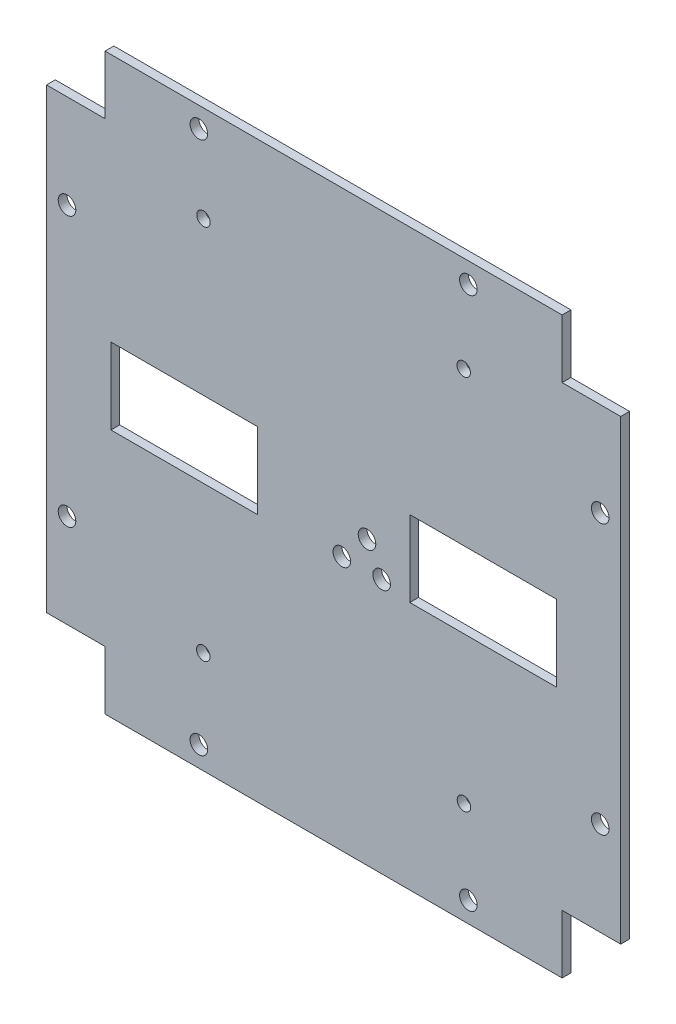
ISO-10303-21;
HEADER;
FILE_DESCRIPTION(('STEP AP214'),'2;1');
FILE_NAME('part.step','',(''),(''),'','','');
FILE_SCHEMA(('AUTOMOTIVE_DESIGN { 1 0 10303 214 1 1 1 1 }'));
ENDSEC;
DATA;
#1=APPLICATION_CONTEXT('core data for automotive mechanical design processes');
#2=APPLICATION_PROTOCOL_DEFINITION('international standard','automotive_design',2000,#1);
#3=PRODUCT_CONTEXT('',#1,'mechanical');
#4=PRODUCT('Part','Part','',(#3));
#5=PRODUCT_RELATED_PRODUCT_CATEGORY('part','',(#4));
#6=PRODUCT_DEFINITION_FORMATION('','',#4);
#7=PRODUCT_DEFINITION_CONTEXT('part definition',#1,'design');
#8=PRODUCT_DEFINITION('design','',#6,#7);
#9=PRODUCT_DEFINITION_SHAPE('','',#8);
#10=(LENGTH_UNIT() NAMED_UNIT(*) SI_UNIT(.MILLI.,.METRE.));
#11=(NAMED_UNIT(*) PLANE_ANGLE_UNIT() SI_UNIT($,.RADIAN.));
#12=(NAMED_UNIT(*) SI_UNIT($,.STERADIAN.) SOLID_ANGLE_UNIT());
#13=UNCERTAINTY_MEASURE_WITH_UNIT(LENGTH_MEASURE(1.E-05),#10,'distance_accuracy_value','');
#14=(GEOMETRIC_REPRESENTATION_CONTEXT(3) GLOBAL_UNCERTAINTY_ASSIGNED_CONTEXT((#13)) GLOBAL_UNIT_ASSIGNED_CONTEXT((#10,
#11,#12)) REPRESENTATION_CONTEXT('',''));
#15=CARTESIAN_POINT('',(0.,0.,0.));
#16=DIRECTION('',(0.,0.,1.));
#17=DIRECTION('',(1.,0.,0.));
#18=AXIS2_PLACEMENT_3D('',#15,#16,#17);
#19=CARTESIAN_POINT('',(-49.,-49.,1.5));
#20=DIRECTION('',(1.,0.,0.));
#21=DIRECTION('',(0.,0.,-1.));
#22=AXIS2_PLACEMENT_3D('',#19,#20,#21);
#23=PLANE('',#22);
#24=DIRECTION('',(0.,-1.,0.));
#25=VECTOR('',#24,1.);
#26=CARTESIAN_POINT('',(-49.,-49.,0.));
#27=LINE('',#26,#25);
#28=CARTESIAN_POINT('',(-49.,39.,0.));
#29=VERTEX_POINT('',#28);
#30=CARTESIAN_POINT('',(-49.,-39.,0.));
#31=VERTEX_POINT('',#30);
#32=EDGE_CURVE('E319',#29,#31,#27,.T.);
#33=ORIENTED_EDGE('',*,*,#32,.T.);
#34=DIRECTION('',(0.,0.,1.));
#35=VECTOR('',#34,1.);
#36=CARTESIAN_POINT('',(-49.,-39.,-8.5));
#37=LINE('',#36,#35);
#38=CARTESIAN_POINT('',(-49.,-39.,1.5));
#39=VERTEX_POINT('',#38);
#40=EDGE_CURVE('E277',#31,#39,#37,.T.);
#41=ORIENTED_EDGE('',*,*,#40,.T.);
#42=DIRECTION('',(0.,-1.,0.));
#43=VECTOR('',#42,1.);
#44=CARTESIAN_POINT('',(-49.,-49.,1.5));
#45=LINE('',#44,#43);
#46=CARTESIAN_POINT('',(-49.,39.,1.5));
#47=VERTEX_POINT('',#46);
#48=EDGE_CURVE('E323',#47,#39,#45,.T.);
#49=ORIENTED_EDGE('',*,*,#48,.F.);
#50=DIRECTION('',(0.,0.,1.));
#51=VECTOR('',#50,1.);
#52=CARTESIAN_POINT('',(-49.,39.,-8.5));
#53=LINE('',#52,#51);
#54=EDGE_CURVE('E315',#29,#47,#53,.T.);
#55=ORIENTED_EDGE('',*,*,#54,.F.);
#56=EDGE_LOOP('',(#33,#41,#49,#55));
#57=FACE_BOUND('',#56,.T.);
#58=ADVANCED_FACE('F37',(#57),#23,.F.);
#59=CARTESIAN_POINT('',(49.,-49.,1.5));
#60=DIRECTION('',(0.,1.,0.));
#61=DIRECTION('',(-1.,0.,0.));
#62=AXIS2_PLACEMENT_3D('',#59,#60,#61);
#63=PLANE('',#62);
#64=DIRECTION('',(1.,0.,0.));
#65=VECTOR('',#64,1.);
#66=CARTESIAN_POINT('',(49.,-49.,1.5));
#67=LINE('',#66,#65);
#68=CARTESIAN_POINT('',(-39.,-49.,1.5));
#69=VERTEX_POINT('',#68);
#70=CARTESIAN_POINT('',(39.,-49.,1.5));
#71=VERTEX_POINT('',#70);
#72=EDGE_CURVE('E326',#69,#71,#67,.T.);
#73=ORIENTED_EDGE('',*,*,#72,.F.);
#74=DIRECTION('',(0.,0.,1.));
#75=VECTOR('',#74,1.);
#76=CARTESIAN_POINT('',(-39.,-49.,-8.5));
#77=LINE('',#76,#75);
#78=CARTESIAN_POINT('',(-39.,-49.,0.));
#79=VERTEX_POINT('',#78);
#80=EDGE_CURVE('E276',#79,#69,#77,.T.);
#81=ORIENTED_EDGE('',*,*,#80,.F.);
#82=DIRECTION('',(1.,0.,0.));
#83=VECTOR('',#82,1.);
#84=CARTESIAN_POINT('',(49.,-49.,0.));
#85=LINE('',#84,#83);
#86=CARTESIAN_POINT('',(39.,-49.,0.));
#87=VERTEX_POINT('',#86);
#88=EDGE_CURVE('E336',#79,#87,#85,.T.);
#89=ORIENTED_EDGE('',*,*,#88,.T.);
#90=DIRECTION('',(0.,0.,1.));
#91=VECTOR('',#90,1.);
#92=CARTESIAN_POINT('',(39.,-49.,-8.5));
#93=LINE('',#92,#91);
#94=EDGE_CURVE('E290',#87,#71,#93,.T.);
#95=ORIENTED_EDGE('',*,*,#94,.T.);
#96=EDGE_LOOP('',(#73,#81,#89,#95));
#97=FACE_BOUND('',#96,.T.);
#98=ADVANCED_FACE('F425',(#97),#63,.F.);
#99=CARTESIAN_POINT('',(49.,-49.,1.5));
#100=DIRECTION('',(-1.,0.,0.));
#101=DIRECTION('',(0.,0.,1.));
#102=AXIS2_PLACEMENT_3D('',#99,#100,#101);
#103=PLANE('',#102);
#104=DIRECTION('',(0.,1.,0.));
#105=VECTOR('',#104,1.);
#106=CARTESIAN_POINT('',(49.,-49.,1.5));
#107=LINE('',#106,#105);
#108=CARTESIAN_POINT('',(49.,-39.,1.5));
#109=VERTEX_POINT('',#108);
#110=CARTESIAN_POINT('',(49.,39.,1.5));
#111=VERTEX_POINT('',#110);
#112=EDGE_CURVE('E329',#109,#111,#107,.T.);
#113=ORIENTED_EDGE('',*,*,#112,.F.);
#114=DIRECTION('',(0.,0.,1.));
#115=VECTOR('',#114,1.);
#116=CARTESIAN_POINT('',(49.,-39.,-8.5));
#117=LINE('',#116,#115);
#118=CARTESIAN_POINT('',(49.,-39.,0.));
#119=VERTEX_POINT('',#118);
#120=EDGE_CURVE('E289',#119,#109,#117,.T.);
#121=ORIENTED_EDGE('',*,*,#120,.F.);
#122=DIRECTION('',(0.,1.,0.));
#123=VECTOR('',#122,1.);
#124=CARTESIAN_POINT('',(49.,-49.,0.));
#125=LINE('',#124,#123);
#126=CARTESIAN_POINT('',(49.,39.,0.));
#127=VERTEX_POINT('',#126);
#128=EDGE_CURVE('E338',#119,#127,#125,.T.);
#129=ORIENTED_EDGE('',*,*,#128,.T.);
#130=DIRECTION('',(0.,0.,1.));
#131=VECTOR('',#130,1.);
#132=CARTESIAN_POINT('',(49.,39.,-8.5));
#133=LINE('',#132,#131);
#134=EDGE_CURVE('E303',#127,#111,#133,.T.);
#135=ORIENTED_EDGE('',*,*,#134,.T.);
#136=EDGE_LOOP('',(#113,#121,#129,#135));
#137=FACE_BOUND('',#136,.T.);
#138=ADVANCED_FACE('F430',(#137),#103,.F.);
#139=CARTESIAN_POINT('',(49.,49.,1.5));
#140=DIRECTION('',(0.,-1.,0.));
#141=DIRECTION('',(1.,0.,0.));
#142=AXIS2_PLACEMENT_3D('',#139,#140,#141);
#143=PLANE('',#142);
#144=DIRECTION('',(-1.,0.,0.));
#145=VECTOR('',#144,1.);
#146=CARTESIAN_POINT('',(49.,49.,1.5));
#147=LINE('',#146,#145);
#148=CARTESIAN_POINT('',(39.,49.,1.5));
#149=VERTEX_POINT('',#148);
#150=CARTESIAN_POINT('',(-39.,49.,1.5));
#151=VERTEX_POINT('',#150);
#152=EDGE_CURVE('E331',#149,#151,#147,.T.);
#153=ORIENTED_EDGE('',*,*,#152,.F.);
#154=DIRECTION('',(0.,0.,1.));
#155=VECTOR('',#154,1.);
#156=CARTESIAN_POINT('',(39.,49.,-8.5));
#157=LINE('',#156,#155);
#158=CARTESIAN_POINT('',(39.,49.,0.));
#159=VERTEX_POINT('',#158);
#160=EDGE_CURVE('E302',#159,#149,#157,.T.);
#161=ORIENTED_EDGE('',*,*,#160,.F.);
#162=DIRECTION('',(-1.,0.,0.));
#163=VECTOR('',#162,1.);
#164=CARTESIAN_POINT('',(49.,49.,0.));
#165=LINE('',#164,#163);
#166=CARTESIAN_POINT('',(-39.,49.,0.));
#167=VERTEX_POINT('',#166);
#168=EDGE_CURVE('E327',#159,#167,#165,.T.);
#169=ORIENTED_EDGE('',*,*,#168,.T.);
#170=DIRECTION('',(0.,0.,1.));
#171=VECTOR('',#170,1.);
#172=CARTESIAN_POINT('',(-39.,49.,-8.5));
#173=LINE('',#172,#171);
#174=EDGE_CURVE('E316',#167,#151,#173,.T.);
#175=ORIENTED_EDGE('',*,*,#174,.T.);
#176=EDGE_LOOP('',(#153,#161,#169,#175));
#177=FACE_BOUND('',#176,.T.);
#178=ADVANCED_FACE('F456',(#177),#143,.F.);
#179=CARTESIAN_POINT('',(0.,0.,1.5));
#180=DIRECTION('',(0.,0.,1.));
#181=DIRECTION('',(1.,0.,0.));
#182=AXIS2_PLACEMENT_3D('',#179,#180,#181);
#183=PLANE('',#182);
#184=CARTESIAN_POINT('',(1.4,-5.49999999999999,1.5));
#185=DIRECTION('',(0.,0.,1.));
#186=DIRECTION('',(1.,0.,0.));
#187=AXIS2_PLACEMENT_3D('',#184,#185,#186);
#188=CIRCLE('',#187,1.49999999999999);
#189=CARTESIAN_POINT('',(2.89999999999999,-5.49999999999999,1.5));
#190=VERTEX_POINT('',#189);
#191=EDGE_CURVE('E785',#190,#190,#188,.T.);
#192=ORIENTED_EDGE('',*,*,#191,.F.);
#193=EDGE_LOOP('',(#192));
#194=FACE_BOUND('',#193,.T.);
#195=CARTESIAN_POINT('',(8.2,-5.49999999999999,1.5));
#196=DIRECTION('',(0.,0.,1.));
#197=DIRECTION('',(1.,0.,0.));
#198=AXIS2_PLACEMENT_3D('',#195,#196,#197);
#199=CIRCLE('',#198,1.49999999999999);
#200=CARTESIAN_POINT('',(9.69999999999999,-5.49999999999999,1.5));
#201=VERTEX_POINT('',#200);
#202=EDGE_CURVE('E795',#201,#201,#199,.T.);
#203=ORIENTED_EDGE('',*,*,#202,.F.);
#204=EDGE_LOOP('',(#203));
#205=FACE_BOUND('',#204,.T.);
#206=CARTESIAN_POINT('',(5.7,-0.799999999999985,1.5));
#207=DIRECTION('',(0.,0.,1.));
#208=DIRECTION('',(1.,0.,0.));
#209=AXIS2_PLACEMENT_3D('',#206,#207,#208);
#210=CIRCLE('',#209,1.5);
#211=CARTESIAN_POINT('',(7.2,-0.799999999999985,1.5));
#212=VERTEX_POINT('',#211);
#213=EDGE_CURVE('E800',#212,#212,#210,.T.);
#214=ORIENTED_EDGE('',*,*,#213,.F.);
#215=EDGE_LOOP('',(#214));
#216=FACE_BOUND('',#215,.T.);
#217=CARTESIAN_POINT('',(-22.2450014404777,-31.5907366922284,1.5));
#218=DIRECTION('',(0.,0.,1.));
#219=DIRECTION('',(1.,0.,0.));
#220=AXIS2_PLACEMENT_3D('',#217,#218,#219);
#221=CIRCLE('',#220,1.14999999999999);
#222=CARTESIAN_POINT('',(-21.0950014404777,-31.5907366922284,1.5));
#223=VERTEX_POINT('',#222);
#224=EDGE_CURVE('E397',#223,#223,#221,.T.);
#225=ORIENTED_EDGE('',*,*,#224,.F.);
#226=EDGE_LOOP('',(#225));
#227=FACE_BOUND('',#226,.T.);
#228=CARTESIAN_POINT('',(-22.2031172324924,32.6338065342235,1.5));
#229=DIRECTION('',(0.,0.,1.));
#230=DIRECTION('',(1.,0.,0.));
#231=AXIS2_PLACEMENT_3D('',#228,#229,#230);
#232=CIRCLE('',#231,1.14999999999999);
#233=CARTESIAN_POINT('',(-21.0531172324924,32.6338065342235,1.5));
#234=VERTEX_POINT('',#233);
#235=EDGE_CURVE('E387',#234,#234,#232,.T.);
#236=ORIENTED_EDGE('',*,*,#235,.F.);
#237=EDGE_LOOP('',(#236));
#238=FACE_BOUND('',#237,.T.);
#239=CARTESIAN_POINT('',(22.2031172324923,32.6338065342236,1.5));
#240=DIRECTION('',(0.,0.,1.));
#241=DIRECTION('',(1.,0.,0.));
#242=AXIS2_PLACEMENT_3D('',#239,#240,#241);
#243=CIRCLE('',#242,1.14999999999999);
#244=CARTESIAN_POINT('',(23.3531172324922,32.6338065342236,1.5));
#245=VERTEX_POINT('',#244);
#246=EDGE_CURVE('E384',#245,#245,#243,.T.);
#247=ORIENTED_EDGE('',*,*,#246,.F.);
#248=EDGE_LOOP('',(#247));
#249=FACE_BOUND('',#248,.T.);
#250=CARTESIAN_POINT('',(22.2450014404779,-31.5907366922282,1.5));
#251=DIRECTION('',(0.,0.,1.));
#252=DIRECTION('',(1.,0.,0.));
#253=AXIS2_PLACEMENT_3D('',#250,#251,#252);
#254=CIRCLE('',#253,1.14999999999999);
#255=CARTESIAN_POINT('',(23.3950014404779,-31.5907366922282,1.5));
#256=VERTEX_POINT('',#255);
#257=EDGE_CURVE('E383',#256,#256,#254,.T.);
#258=ORIENTED_EDGE('',*,*,#257,.F.);
#259=EDGE_LOOP('',(#258));
#260=FACE_BOUND('',#259,.T.);
#261=DIRECTION('',(1.,0.,0.));
#262=VECTOR('',#261,1.);
#263=CARTESIAN_POINT('',(38.,-6.49999999999999,1.5));
#264=LINE('',#263,#262);
#265=CARTESIAN_POINT('',(13.,-6.49999999999999,1.5));
#266=VERTEX_POINT('',#265);
#267=CARTESIAN_POINT('',(38.,-6.49999999999999,1.5));
#268=VERTEX_POINT('',#267);
#269=EDGE_CURVE('E53',#266,#268,#264,.T.);
#270=ORIENTED_EDGE('',*,*,#269,.F.);
#271=DIRECTION('',(0.,-1.,0.));
#272=VECTOR('',#271,1.);
#273=CARTESIAN_POINT('',(13.,-6.49999999999999,1.5));
#274=LINE('',#273,#272);
#275=CARTESIAN_POINT('',(13.,6.50000000000001,1.5));
#276=VERTEX_POINT('',#275);
#277=EDGE_CURVE('E194',#276,#266,#274,.T.);
#278=ORIENTED_EDGE('',*,*,#277,.F.);
#279=DIRECTION('',(-1.,0.,0.));
#280=VECTOR('',#279,1.);
#281=CARTESIAN_POINT('',(38.,6.50000000000001,1.5));
#282=LINE('',#281,#280);
#283=CARTESIAN_POINT('',(38.,6.50000000000001,1.5));
#284=VERTEX_POINT('',#283);
#285=EDGE_CURVE('E178',#284,#276,#282,.T.);
#286=ORIENTED_EDGE('',*,*,#285,.F.);
#287=DIRECTION('',(0.,1.,0.));
#288=VECTOR('',#287,1.);
#289=CARTESIAN_POINT('',(38.,-6.49999999999999,1.5));
#290=LINE('',#289,#288);
#291=EDGE_CURVE('E187',#268,#284,#290,.T.);
#292=ORIENTED_EDGE('',*,*,#291,.F.);
#293=EDGE_LOOP('',(#270,#278,#286,#292));
#294=FACE_BOUND('',#293,.T.);
#295=DIRECTION('',(0.,-1.,0.));
#296=VECTOR('',#295,1.);
#297=CARTESIAN_POINT('',(-38.,-6.49999999999999,1.5));
#298=LINE('',#297,#296);
#299=CARTESIAN_POINT('',(-38.,6.50000000000001,1.5));
#300=VERTEX_POINT('',#299);
#301=CARTESIAN_POINT('',(-38.,-6.49999999999999,1.5));
#302=VERTEX_POINT('',#301);
#303=EDGE_CURVE('E201',#300,#302,#298,.T.);
#304=ORIENTED_EDGE('',*,*,#303,.F.);
#305=DIRECTION('',(-1.,0.,0.));
#306=VECTOR('',#305,1.);
#307=CARTESIAN_POINT('',(-38.,6.50000000000001,1.5));
#308=LINE('',#307,#306);
#309=CARTESIAN_POINT('',(-13.,6.50000000000001,1.5));
#310=VERTEX_POINT('',#309);
#311=EDGE_CURVE('E211',#310,#300,#308,.T.);
#312=ORIENTED_EDGE('',*,*,#311,.F.);
#313=DIRECTION('',(0.,1.,0.));
#314=VECTOR('',#313,1.);
#315=CARTESIAN_POINT('',(-13.,-6.49999999999999,1.5));
#316=LINE('',#315,#314);
#317=CARTESIAN_POINT('',(-13.,-6.49999999999999,1.5));
#318=VERTEX_POINT('',#317);
#319=EDGE_CURVE('E208',#318,#310,#316,.T.);
#320=ORIENTED_EDGE('',*,*,#319,.F.);
#321=DIRECTION('',(1.,0.,0.));
#322=VECTOR('',#321,1.);
#323=CARTESIAN_POINT('',(-38.,-6.49999999999999,1.5));
#324=LINE('',#323,#322);
#325=EDGE_CURVE('E205',#302,#318,#324,.T.);
#326=ORIENTED_EDGE('',*,*,#325,.F.);
#327=EDGE_LOOP('',(#304,#312,#320,#326));
#328=FACE_BOUND('',#327,.T.);
#329=CARTESIAN_POINT('',(23.000000000001,45.5,1.5));
#330=DIRECTION('',(0.,0.,-1.));
#331=DIRECTION('',(-1.,0.,0.));
#332=AXIS2_PLACEMENT_3D('',#329,#330,#331);
#333=CIRCLE('',#332,1.5);
#334=CARTESIAN_POINT('',(21.500000000001,45.5,1.5));
#335=VERTEX_POINT('',#334);
#336=EDGE_CURVE('E226',#335,#335,#333,.T.);
#337=ORIENTED_EDGE('',*,*,#336,.T.);
#338=EDGE_LOOP('',(#337));
#339=FACE_BOUND('',#338,.T.);
#340=CARTESIAN_POINT('',(-22.999999999999,45.5000000000002,1.5));
#341=DIRECTION('',(0.,0.,-1.));
#342=DIRECTION('',(-1.,0.,0.));
#343=AXIS2_PLACEMENT_3D('',#340,#341,#342);
#344=CIRCLE('',#343,1.5);
#345=CARTESIAN_POINT('',(-24.499999999999,45.5000000000002,1.5));
#346=VERTEX_POINT('',#345);
#347=EDGE_CURVE('E232',#346,#346,#344,.T.);
#348=ORIENTED_EDGE('',*,*,#347,.T.);
#349=EDGE_LOOP('',(#348));
#350=FACE_BOUND('',#349,.T.);
#351=CARTESIAN_POINT('',(-45.4999999999991,23.0000000000003,1.5));
#352=DIRECTION('',(0.,0.,-1.));
#353=DIRECTION('',(-1.,0.,0.));
#354=AXIS2_PLACEMENT_3D('',#351,#352,#353);
#355=CIRCLE('',#354,1.5);
#356=CARTESIAN_POINT('',(-46.9999999999991,23.0000000000003,1.5));
#357=VERTEX_POINT('',#356);
#358=EDGE_CURVE('E238',#357,#357,#355,.T.);
#359=ORIENTED_EDGE('',*,*,#358,.T.);
#360=EDGE_LOOP('',(#359));
#361=FACE_BOUND('',#360,.T.);
#362=CARTESIAN_POINT('',(-45.4999999999993,-22.9999999999997,1.5));
#363=DIRECTION('',(0.,0.,-1.));
#364=DIRECTION('',(-1.,0.,0.));
#365=AXIS2_PLACEMENT_3D('',#362,#363,#364);
#366=CIRCLE('',#365,1.5);
#367=CARTESIAN_POINT('',(-46.9999999999993,-22.9999999999997,1.5));
#368=VERTEX_POINT('',#367);
#369=EDGE_CURVE('E244',#368,#368,#366,.T.);
#370=ORIENTED_EDGE('',*,*,#369,.T.);
#371=EDGE_LOOP('',(#370));
#372=FACE_BOUND('',#371,.T.);
#373=CARTESIAN_POINT('',(-22.9999999999994,-45.4999999999998,1.5));
#374=DIRECTION('',(0.,0.,-1.));
#375=DIRECTION('',(-1.,0.,0.));
#376=AXIS2_PLACEMENT_3D('',#373,#374,#375);
#377=CIRCLE('',#376,1.5);
#378=CARTESIAN_POINT('',(-24.4999999999994,-45.4999999999998,1.5));
#379=VERTEX_POINT('',#378);
#380=EDGE_CURVE('E250',#379,#379,#377,.T.);
#381=ORIENTED_EDGE('',*,*,#380,.T.);
#382=EDGE_LOOP('',(#381));
#383=FACE_BOUND('',#382,.T.);
#384=CARTESIAN_POINT('',(23.0000000000006,-45.5,1.5));
#385=DIRECTION('',(0.,0.,-1.));
#386=DIRECTION('',(-1.,0.,0.));
#387=AXIS2_PLACEMENT_3D('',#384,#385,#386);
#388=CIRCLE('',#387,1.5);
#389=CARTESIAN_POINT('',(21.5000000000006,-45.5,1.5));
#390=VERTEX_POINT('',#389);
#391=EDGE_CURVE('E256',#390,#390,#388,.T.);
#392=ORIENTED_EDGE('',*,*,#391,.T.);
#393=EDGE_LOOP('',(#392));
#394=FACE_BOUND('',#393,.T.);
#395=CARTESIAN_POINT('',(45.5000000000007,-23.0000000000001,1.5));
#396=DIRECTION('',(0.,0.,-1.));
#397=DIRECTION('',(-1.,0.,0.));
#398=AXIS2_PLACEMENT_3D('',#395,#396,#397);
#399=CIRCLE('',#398,1.5);
#400=CARTESIAN_POINT('',(44.0000000000007,-23.0000000000001,1.5));
#401=VERTEX_POINT('',#400);
#402=EDGE_CURVE('E262',#401,#401,#399,.T.);
#403=ORIENTED_EDGE('',*,*,#402,.T.);
#404=EDGE_LOOP('',(#403));
#405=FACE_BOUND('',#404,.T.);
#406=CARTESIAN_POINT('',(45.5000000000009,22.9999999999999,1.5));
#407=DIRECTION('',(0.,0.,-1.));
#408=DIRECTION('',(-1.,0.,0.));
#409=AXIS2_PLACEMENT_3D('',#406,#407,#408);
#410=CIRCLE('',#409,1.5);
#411=CARTESIAN_POINT('',(44.0000000000009,22.9999999999999,1.5));
#412=VERTEX_POINT('',#411);
#413=EDGE_CURVE('E268',#412,#412,#410,.T.);
#414=ORIENTED_EDGE('',*,*,#413,.T.);
#415=EDGE_LOOP('',(#414));
#416=FACE_BOUND('',#415,.T.);
#417=DIRECTION('',(-1.,0.,0.));
#418=VECTOR('',#417,1.);
#419=CARTESIAN_POINT('',(-49.,-39.,1.5));
#420=LINE('',#419,#418);
#421=CARTESIAN_POINT('',(-39.,-39.,1.5));
#422=VERTEX_POINT('',#421);
#423=EDGE_CURVE('E274',#422,#39,#420,.T.);
#424=ORIENTED_EDGE('',*,*,#423,.F.);
#425=DIRECTION('',(0.,1.,0.));
#426=VECTOR('',#425,1.);
#427=CARTESIAN_POINT('',(-39.,-49.,1.5));
#428=LINE('',#427,#426);
#429=EDGE_CURVE('E271',#69,#422,#428,.T.);
#430=ORIENTED_EDGE('',*,*,#429,.F.);
#431=ORIENTED_EDGE('',*,*,#72,.T.);
#432=DIRECTION('',(0.,-1.,0.));
#433=VECTOR('',#432,1.);
#434=CARTESIAN_POINT('',(39.,-49.,1.5));
#435=LINE('',#434,#433);
#436=CARTESIAN_POINT('',(39.,-39.,1.5));
#437=VERTEX_POINT('',#436);
#438=EDGE_CURVE('E286',#437,#71,#435,.T.);
#439=ORIENTED_EDGE('',*,*,#438,.F.);
#440=DIRECTION('',(-1.,0.,0.));
#441=VECTOR('',#440,1.);
#442=CARTESIAN_POINT('',(49.,-39.,1.5));
#443=LINE('',#442,#441);
#444=EDGE_CURVE('E280',#109,#437,#443,.T.);
#445=ORIENTED_EDGE('',*,*,#444,.F.);
#446=ORIENTED_EDGE('',*,*,#112,.T.);
#447=DIRECTION('',(1.,0.,0.));
#448=VECTOR('',#447,1.);
#449=CARTESIAN_POINT('',(49.,39.,1.5));
#450=LINE('',#449,#448);
#451=CARTESIAN_POINT('',(39.,39.,1.5));
#452=VERTEX_POINT('',#451);
#453=EDGE_CURVE('E299',#452,#111,#450,.T.);
#454=ORIENTED_EDGE('',*,*,#453,.F.);
#455=DIRECTION('',(0.,-1.,0.));
#456=VECTOR('',#455,1.);
#457=CARTESIAN_POINT('',(39.,49.,1.5));
#458=LINE('',#457,#456);
#459=EDGE_CURVE('E293',#149,#452,#458,.T.);
#460=ORIENTED_EDGE('',*,*,#459,.F.);
#461=ORIENTED_EDGE('',*,*,#152,.T.);
#462=DIRECTION('',(0.,1.,0.));
#463=VECTOR('',#462,1.);
#464=CARTESIAN_POINT('',(-39.,49.,1.5));
#465=LINE('',#464,#463);
#466=CARTESIAN_POINT('',(-39.,39.,1.5));
#467=VERTEX_POINT('',#466);
#468=EDGE_CURVE('E312',#467,#151,#465,.T.);
#469=ORIENTED_EDGE('',*,*,#468,.F.);
#470=DIRECTION('',(1.,0.,0.));
#471=VECTOR('',#470,1.);
#472=CARTESIAN_POINT('',(-49.,39.,1.5));
#473=LINE('',#472,#471);
#474=EDGE_CURVE('E306',#47,#467,#473,.T.);
#475=ORIENTED_EDGE('',*,*,#474,.F.);
#476=ORIENTED_EDGE('',*,*,#48,.T.);
#477=EDGE_LOOP('',(#424,#430,#431,#439,#445,#446,#454,#460,#461,#469,#475,#476));
#478=FACE_BOUND('',#477,.T.);
#479=ADVANCED_FACE('F191',(#194,#205,#216,#227,#238,#249,#260,#294,#328,#339,#350,#361,#372,
#383,#394,#405,#416,#478),#183,.T.);
#480=CARTESIAN_POINT('',(0.,0.,0.));
#481=DIRECTION('',(0.,0.,1.));
#482=DIRECTION('',(1.,0.,0.));
#483=AXIS2_PLACEMENT_3D('',#480,#481,#482);
#484=PLANE('',#483);
#485=CARTESIAN_POINT('',(1.4,-5.49999999999999,0.));
#486=DIRECTION('',(0.,0.,-1.));
#487=DIRECTION('',(-1.,0.,0.));
#488=AXIS2_PLACEMENT_3D('',#485,#486,#487);
#489=CIRCLE('',#488,1.49999999999999);
#490=CARTESIAN_POINT('',(-0.0999999999999859,-5.49999999999999,0.));
#491=VERTEX_POINT('',#490);
#492=EDGE_CURVE('E788',#491,#491,#489,.T.);
#493=ORIENTED_EDGE('',*,*,#492,.F.);
#494=EDGE_LOOP('',(#493));
#495=FACE_BOUND('',#494,.T.);
#496=CARTESIAN_POINT('',(8.2,-5.49999999999999,0.));
#497=DIRECTION('',(0.,0.,-1.));
#498=DIRECTION('',(-1.,0.,0.));
#499=AXIS2_PLACEMENT_3D('',#496,#497,#498);
#500=CIRCLE('',#499,1.49999999999999);
#501=CARTESIAN_POINT('',(6.70000000000002,-5.49999999999999,0.));
#502=VERTEX_POINT('',#501);
#503=EDGE_CURVE('E790',#502,#502,#500,.T.);
#504=ORIENTED_EDGE('',*,*,#503,.F.);
#505=EDGE_LOOP('',(#504));
#506=FACE_BOUND('',#505,.T.);
#507=CARTESIAN_POINT('',(5.7,-0.799999999999985,0.));
#508=DIRECTION('',(0.,0.,-1.));
#509=DIRECTION('',(-1.,0.,0.));
#510=AXIS2_PLACEMENT_3D('',#507,#508,#509);
#511=CIRCLE('',#510,1.5);
#512=CARTESIAN_POINT('',(4.2,-0.799999999999985,0.));
#513=VERTEX_POINT('',#512);
#514=EDGE_CURVE('E798',#513,#513,#511,.T.);
#515=ORIENTED_EDGE('',*,*,#514,.F.);
#516=EDGE_LOOP('',(#515));
#517=FACE_BOUND('',#516,.T.);
#518=CARTESIAN_POINT('',(-22.2450014404777,-31.5907366922284,0.));
#519=DIRECTION('',(0.,0.,1.));
#520=DIRECTION('',(1.,0.,0.));
#521=AXIS2_PLACEMENT_3D('',#518,#519,#520);
#522=CIRCLE('',#521,1.14999999999999);
#523=CARTESIAN_POINT('',(-21.0950014404777,-31.5907366922284,0.));
#524=VERTEX_POINT('',#523);
#525=EDGE_CURVE('E40',#524,#524,#522,.T.);
#526=ORIENTED_EDGE('',*,*,#525,.T.);
#527=EDGE_LOOP('',(#526));
#528=FACE_BOUND('',#527,.T.);
#529=CARTESIAN_POINT('',(-22.2031172324924,32.6338065342235,0.));
#530=DIRECTION('',(0.,0.,1.));
#531=DIRECTION('',(1.,0.,0.));
#532=AXIS2_PLACEMENT_3D('',#529,#530,#531);
#533=CIRCLE('',#532,1.14999999999999);
#534=CARTESIAN_POINT('',(-21.0531172324924,32.6338065342235,0.));
#535=VERTEX_POINT('',#534);
#536=EDGE_CURVE('E385',#535,#535,#533,.T.);
#537=ORIENTED_EDGE('',*,*,#536,.T.);
#538=EDGE_LOOP('',(#537));
#539=FACE_BOUND('',#538,.T.);
#540=CARTESIAN_POINT('',(22.2031172324923,32.6338065342236,0.));
#541=DIRECTION('',(0.,0.,1.));
#542=DIRECTION('',(1.,0.,0.));
#543=AXIS2_PLACEMENT_3D('',#540,#541,#542);
#544=CIRCLE('',#543,1.14999999999999);
#545=CARTESIAN_POINT('',(23.3531172324922,32.6338065342236,0.));
#546=VERTEX_POINT('',#545);
#547=EDGE_CURVE('E381',#546,#546,#544,.T.);
#548=ORIENTED_EDGE('',*,*,#547,.T.);
#549=EDGE_LOOP('',(#548));
#550=FACE_BOUND('',#549,.T.);
#551=CARTESIAN_POINT('',(22.2450014404779,-31.5907366922282,0.));
#552=DIRECTION('',(0.,0.,1.));
#553=DIRECTION('',(1.,0.,0.));
#554=AXIS2_PLACEMENT_3D('',#551,#552,#553);
#555=CIRCLE('',#554,1.14999999999999);
#556=CARTESIAN_POINT('',(23.3950014404779,-31.5907366922282,0.));
#557=VERTEX_POINT('',#556);
#558=EDGE_CURVE('E403',#557,#557,#555,.T.);
#559=ORIENTED_EDGE('',*,*,#558,.T.);
#560=EDGE_LOOP('',(#559));
#561=FACE_BOUND('',#560,.T.);
#562=DIRECTION('',(0.,-1.,0.));
#563=VECTOR('',#562,1.);
#564=CARTESIAN_POINT('',(13.,0.,0.));
#565=LINE('',#564,#563);
#566=CARTESIAN_POINT('',(13.,6.50000000000001,0.));
#567=VERTEX_POINT('',#566);
#568=CARTESIAN_POINT('',(13.,-6.49999999999999,0.));
#569=VERTEX_POINT('',#568);
#570=EDGE_CURVE('E45',#567,#569,#565,.T.);
#571=ORIENTED_EDGE('',*,*,#570,.T.);
#572=DIRECTION('',(1.,0.,0.));
#573=VECTOR('',#572,1.);
#574=CARTESIAN_POINT('',(0.,-6.49999999999999,0.));
#575=LINE('',#574,#573);
#576=CARTESIAN_POINT('',(38.,-6.49999999999999,0.));
#577=VERTEX_POINT('',#576);
#578=EDGE_CURVE('E11',#569,#577,#575,.T.);
#579=ORIENTED_EDGE('',*,*,#578,.T.);
#580=DIRECTION('',(0.,1.,0.));
#581=VECTOR('',#580,1.);
#582=CARTESIAN_POINT('',(38.,0.,0.));
#583=LINE('',#582,#581);
#584=CARTESIAN_POINT('',(38.,6.50000000000001,0.));
#585=VERTEX_POINT('',#584);
#586=EDGE_CURVE('E376',#577,#585,#583,.T.);
#587=ORIENTED_EDGE('',*,*,#586,.T.);
#588=DIRECTION('',(-1.,0.,0.));
#589=VECTOR('',#588,1.);
#590=CARTESIAN_POINT('',(0.,6.50000000000001,0.));
#591=LINE('',#590,#589);
#592=EDGE_CURVE('E181',#585,#567,#591,.T.);
#593=ORIENTED_EDGE('',*,*,#592,.T.);
#594=EDGE_LOOP('',(#571,#579,#587,#593));
#595=FACE_BOUND('',#594,.T.);
#596=DIRECTION('',(-1.,0.,0.));
#597=VECTOR('',#596,1.);
#598=CARTESIAN_POINT('',(0.,6.50000000000001,0.));
#599=LINE('',#598,#597);
#600=CARTESIAN_POINT('',(-13.,6.50000000000001,0.));
#601=VERTEX_POINT('',#600);
#602=CARTESIAN_POINT('',(-38.,6.50000000000001,0.));
#603=VERTEX_POINT('',#602);
#604=EDGE_CURVE('E370',#601,#603,#599,.T.);
#605=ORIENTED_EDGE('',*,*,#604,.T.);
#606=DIRECTION('',(0.,-1.,0.));
#607=VECTOR('',#606,1.);
#608=CARTESIAN_POINT('',(-38.,0.,0.));
#609=LINE('',#608,#607);
#610=CARTESIAN_POINT('',(-38.,-6.49999999999999,0.));
#611=VERTEX_POINT('',#610);
#612=EDGE_CURVE('E373',#603,#611,#609,.T.);
#613=ORIENTED_EDGE('',*,*,#612,.T.);
#614=DIRECTION('',(1.,0.,0.));
#615=VECTOR('',#614,1.);
#616=CARTESIAN_POINT('',(0.,-6.49999999999999,0.));
#617=LINE('',#616,#615);
#618=CARTESIAN_POINT('',(-13.,-6.49999999999999,0.));
#619=VERTEX_POINT('',#618);
#620=EDGE_CURVE('E364',#611,#619,#617,.T.);
#621=ORIENTED_EDGE('',*,*,#620,.T.);
#622=DIRECTION('',(0.,1.,0.));
#623=VECTOR('',#622,1.);
#624=CARTESIAN_POINT('',(-13.,0.,0.));
#625=LINE('',#624,#623);
#626=EDGE_CURVE('E367',#619,#601,#625,.T.);
#627=ORIENTED_EDGE('',*,*,#626,.T.);
#628=EDGE_LOOP('',(#605,#613,#621,#627));
#629=FACE_BOUND('',#628,.T.);
#630=CARTESIAN_POINT('',(23.000000000001,45.5,0.));
#631=DIRECTION('',(0.,0.,-1.));
#632=DIRECTION('',(-1.,0.,0.));
#633=AXIS2_PLACEMENT_3D('',#630,#631,#632);
#634=CIRCLE('',#633,1.5);
#635=CARTESIAN_POINT('',(21.500000000001,45.5,0.));
#636=VERTEX_POINT('',#635);
#637=EDGE_CURVE('E217',#636,#636,#634,.T.);
#638=ORIENTED_EDGE('',*,*,#637,.F.);
#639=EDGE_LOOP('',(#638));
#640=FACE_BOUND('',#639,.T.);
#641=CARTESIAN_POINT('',(-22.999999999999,45.5000000000002,0.));
#642=DIRECTION('',(0.,0.,-1.));
#643=DIRECTION('',(-1.,0.,0.));
#644=AXIS2_PLACEMENT_3D('',#641,#642,#643);
#645=CIRCLE('',#644,1.5);
#646=CARTESIAN_POINT('',(-24.499999999999,45.5000000000002,0.));
#647=VERTEX_POINT('',#646);
#648=EDGE_CURVE('E229',#647,#647,#645,.T.);
#649=ORIENTED_EDGE('',*,*,#648,.F.);
#650=EDGE_LOOP('',(#649));
#651=FACE_BOUND('',#650,.T.);
#652=CARTESIAN_POINT('',(-45.4999999999991,23.0000000000003,0.));
#653=DIRECTION('',(0.,0.,-1.));
#654=DIRECTION('',(-1.,0.,0.));
#655=AXIS2_PLACEMENT_3D('',#652,#653,#654);
#656=CIRCLE('',#655,1.5);
#657=CARTESIAN_POINT('',(-46.9999999999991,23.0000000000003,0.));
#658=VERTEX_POINT('',#657);
#659=EDGE_CURVE('E235',#658,#658,#656,.T.);
#660=ORIENTED_EDGE('',*,*,#659,.F.);
#661=EDGE_LOOP('',(#660));
#662=FACE_BOUND('',#661,.T.);
#663=CARTESIAN_POINT('',(-45.4999999999993,-22.9999999999997,0.));
#664=DIRECTION('',(0.,0.,-1.));
#665=DIRECTION('',(-1.,0.,0.));
#666=AXIS2_PLACEMENT_3D('',#663,#664,#665);
#667=CIRCLE('',#666,1.5);
#668=CARTESIAN_POINT('',(-46.9999999999993,-22.9999999999997,0.));
#669=VERTEX_POINT('',#668);
#670=EDGE_CURVE('E241',#669,#669,#667,.T.);
#671=ORIENTED_EDGE('',*,*,#670,.F.);
#672=EDGE_LOOP('',(#671));
#673=FACE_BOUND('',#672,.T.);
#674=CARTESIAN_POINT('',(-22.9999999999994,-45.4999999999998,0.));
#675=DIRECTION('',(0.,0.,-1.));
#676=DIRECTION('',(-1.,0.,0.));
#677=AXIS2_PLACEMENT_3D('',#674,#675,#676);
#678=CIRCLE('',#677,1.5);
#679=CARTESIAN_POINT('',(-24.4999999999994,-45.4999999999998,0.));
#680=VERTEX_POINT('',#679);
#681=EDGE_CURVE('E247',#680,#680,#678,.T.);
#682=ORIENTED_EDGE('',*,*,#681,.F.);
#683=EDGE_LOOP('',(#682));
#684=FACE_BOUND('',#683,.T.);
#685=CARTESIAN_POINT('',(23.0000000000006,-45.5,0.));
#686=DIRECTION('',(0.,0.,-1.));
#687=DIRECTION('',(-1.,0.,0.));
#688=AXIS2_PLACEMENT_3D('',#685,#686,#687);
#689=CIRCLE('',#688,1.5);
#690=CARTESIAN_POINT('',(21.5000000000006,-45.5,0.));
#691=VERTEX_POINT('',#690);
#692=EDGE_CURVE('E253',#691,#691,#689,.T.);
#693=ORIENTED_EDGE('',*,*,#692,.F.);
#694=EDGE_LOOP('',(#693));
#695=FACE_BOUND('',#694,.T.);
#696=CARTESIAN_POINT('',(45.5000000000007,-23.0000000000001,0.));
#697=DIRECTION('',(0.,0.,-1.));
#698=DIRECTION('',(-1.,0.,0.));
#699=AXIS2_PLACEMENT_3D('',#696,#697,#698);
#700=CIRCLE('',#699,1.5);
#701=CARTESIAN_POINT('',(44.0000000000007,-23.0000000000001,0.));
#702=VERTEX_POINT('',#701);
#703=EDGE_CURVE('E259',#702,#702,#700,.T.);
#704=ORIENTED_EDGE('',*,*,#703,.F.);
#705=EDGE_LOOP('',(#704));
#706=FACE_BOUND('',#705,.T.);
#707=CARTESIAN_POINT('',(45.5000000000009,22.9999999999999,0.));
#708=DIRECTION('',(0.,0.,-1.));
#709=DIRECTION('',(-1.,0.,0.));
#710=AXIS2_PLACEMENT_3D('',#707,#708,#709);
#711=CIRCLE('',#710,1.5);
#712=CARTESIAN_POINT('',(44.0000000000009,22.9999999999999,0.));
#713=VERTEX_POINT('',#712);
#714=EDGE_CURVE('E265',#713,#713,#711,.T.);
#715=ORIENTED_EDGE('',*,*,#714,.F.);
#716=EDGE_LOOP('',(#715));
#717=FACE_BOUND('',#716,.T.);
#718=DIRECTION('',(0.,1.,0.));
#719=VECTOR('',#718,1.);
#720=CARTESIAN_POINT('',(-39.,0.,0.));
#721=LINE('',#720,#719);
#722=CARTESIAN_POINT('',(-39.,-39.,0.));
#723=VERTEX_POINT('',#722);
#724=EDGE_CURVE('E358',#79,#723,#721,.T.);
#725=ORIENTED_EDGE('',*,*,#724,.T.);
#726=DIRECTION('',(-1.,0.,0.));
#727=VECTOR('',#726,1.);
#728=CARTESIAN_POINT('',(0.,-39.,0.));
#729=LINE('',#728,#727);
#730=EDGE_CURVE('E361',#723,#31,#729,.T.);
#731=ORIENTED_EDGE('',*,*,#730,.T.);
#732=ORIENTED_EDGE('',*,*,#32,.F.);
#733=DIRECTION('',(1.,0.,0.));
#734=VECTOR('',#733,1.);
#735=CARTESIAN_POINT('',(0.,39.,0.));
#736=LINE('',#735,#734);
#737=CARTESIAN_POINT('',(-39.,39.,0.));
#738=VERTEX_POINT('',#737);
#739=EDGE_CURVE('E333',#29,#738,#736,.T.);
#740=ORIENTED_EDGE('',*,*,#739,.T.);
#741=DIRECTION('',(0.,1.,0.));
#742=VECTOR('',#741,1.);
#743=CARTESIAN_POINT('',(-39.,0.,0.));
#744=LINE('',#743,#742);
#745=EDGE_CURVE('E343',#738,#167,#744,.T.);
#746=ORIENTED_EDGE('',*,*,#745,.T.);
#747=ORIENTED_EDGE('',*,*,#168,.F.);
#748=DIRECTION('',(0.,-1.,0.));
#749=VECTOR('',#748,1.);
#750=CARTESIAN_POINT('',(39.,0.,0.));
#751=LINE('',#750,#749);
#752=CARTESIAN_POINT('',(39.,39.,0.));
#753=VERTEX_POINT('',#752);
#754=EDGE_CURVE('E346',#159,#753,#751,.T.);
#755=ORIENTED_EDGE('',*,*,#754,.T.);
#756=DIRECTION('',(1.,0.,0.));
#757=VECTOR('',#756,1.);
#758=CARTESIAN_POINT('',(0.,39.,0.));
#759=LINE('',#758,#757);
#760=EDGE_CURVE('E349',#753,#127,#759,.T.);
#761=ORIENTED_EDGE('',*,*,#760,.T.);
#762=ORIENTED_EDGE('',*,*,#128,.F.);
#763=DIRECTION('',(-1.,0.,0.));
#764=VECTOR('',#763,1.);
#765=CARTESIAN_POINT('',(0.,-39.,0.));
#766=LINE('',#765,#764);
#767=CARTESIAN_POINT('',(39.,-39.,0.));
#768=VERTEX_POINT('',#767);
#769=EDGE_CURVE('E352',#119,#768,#766,.T.);
#770=ORIENTED_EDGE('',*,*,#769,.T.);
#771=DIRECTION('',(0.,-1.,0.));
#772=VECTOR('',#771,1.);
#773=CARTESIAN_POINT('',(39.,0.,0.));
#774=LINE('',#773,#772);
#775=EDGE_CURVE('E355',#768,#87,#774,.T.);
#776=ORIENTED_EDGE('',*,*,#775,.T.);
#777=ORIENTED_EDGE('',*,*,#88,.F.);
#778=EDGE_LOOP('',(#725,#731,#732,#740,#746,#747,#755,#761,#762,#770,#776,#777));
#779=FACE_BOUND('',#778,.T.);
#780=ADVANCED_FACE('F407',(#495,#506,#517,#528,#539,#550,#561,#595,#629,#640,#651,#662,#673,
#684,#695,#706,#717,#779),#484,.F.);
#781=CARTESIAN_POINT('',(-39.,49.,-8.5));
#782=DIRECTION('',(1.,0.,0.));
#783=DIRECTION('',(0.,0.,-1.));
#784=AXIS2_PLACEMENT_3D('',#781,#782,#783);
#785=PLANE('',#784);
#786=DIRECTION('',(0.,0.,1.));
#787=VECTOR('',#786,1.);
#788=CARTESIAN_POINT('',(-39.,39.,-8.5));
#789=LINE('',#788,#787);
#790=EDGE_CURVE('E320',#738,#467,#789,.T.);
#791=ORIENTED_EDGE('',*,*,#790,.T.);
#792=ORIENTED_EDGE('',*,*,#468,.T.);
#793=ORIENTED_EDGE('',*,*,#174,.F.);
#794=ORIENTED_EDGE('',*,*,#745,.F.);
#795=EDGE_LOOP('',(#791,#792,#793,#794));
#796=FACE_BOUND('',#795,.T.);
#797=ADVANCED_FACE('F451',(#796),#785,.F.);
#798=CARTESIAN_POINT('',(-49.,39.,-8.5));
#799=DIRECTION('',(0.,-1.,0.));
#800=DIRECTION('',(0.,0.,-1.));
#801=AXIS2_PLACEMENT_3D('',#798,#799,#800);
#802=PLANE('',#801);
#803=ORIENTED_EDGE('',*,*,#54,.T.);
#804=ORIENTED_EDGE('',*,*,#474,.T.);
#805=ORIENTED_EDGE('',*,*,#790,.F.);
#806=ORIENTED_EDGE('',*,*,#739,.F.);
#807=EDGE_LOOP('',(#803,#804,#805,#806));
#808=FACE_BOUND('',#807,.T.);
#809=ADVANCED_FACE('F447',(#808),#802,.F.);
#810=CARTESIAN_POINT('',(49.,39.,-8.5));
#811=DIRECTION('',(0.,-1.,0.));
#812=DIRECTION('',(0.,0.,-1.));
#813=AXIS2_PLACEMENT_3D('',#810,#811,#812);
#814=PLANE('',#813);
#815=DIRECTION('',(0.,0.,1.));
#816=VECTOR('',#815,1.);
#817=CARTESIAN_POINT('',(39.,39.,-8.5));
#818=LINE('',#817,#816);
#819=EDGE_CURVE('E307',#753,#452,#818,.T.);
#820=ORIENTED_EDGE('',*,*,#819,.T.);
#821=ORIENTED_EDGE('',*,*,#453,.T.);
#822=ORIENTED_EDGE('',*,*,#134,.F.);
#823=ORIENTED_EDGE('',*,*,#760,.F.);
#824=EDGE_LOOP('',(#820,#821,#822,#823));
#825=FACE_BOUND('',#824,.T.);
#826=ADVANCED_FACE('F465',(#825),#814,.F.);
#827=CARTESIAN_POINT('',(39.,49.,-8.5));
#828=DIRECTION('',(-1.,0.,0.));
#829=DIRECTION('',(0.,0.,1.));
#830=AXIS2_PLACEMENT_3D('',#827,#828,#829);
#831=PLANE('',#830);
#832=ORIENTED_EDGE('',*,*,#160,.T.);
#833=ORIENTED_EDGE('',*,*,#459,.T.);
#834=ORIENTED_EDGE('',*,*,#819,.F.);
#835=ORIENTED_EDGE('',*,*,#754,.F.);
#836=EDGE_LOOP('',(#832,#833,#834,#835));
#837=FACE_BOUND('',#836,.T.);
#838=ADVANCED_FACE('F459',(#837),#831,.F.);
#839=CARTESIAN_POINT('',(39.,-49.,-8.5));
#840=DIRECTION('',(-1.,0.,0.));
#841=DIRECTION('',(0.,-1.,0.));
#842=AXIS2_PLACEMENT_3D('',#839,#840,#841);
#843=PLANE('',#842);
#844=DIRECTION('',(0.,0.,1.));
#845=VECTOR('',#844,1.);
#846=CARTESIAN_POINT('',(39.,-39.,-8.5));
#847=LINE('',#846,#845);
#848=EDGE_CURVE('E294',#768,#437,#847,.T.);
#849=ORIENTED_EDGE('',*,*,#848,.T.);
#850=ORIENTED_EDGE('',*,*,#438,.T.);
#851=ORIENTED_EDGE('',*,*,#94,.F.);
#852=ORIENTED_EDGE('',*,*,#775,.F.);
#853=EDGE_LOOP('',(#849,#850,#851,#852));
#854=FACE_BOUND('',#853,.T.);
#855=ADVANCED_FACE('F476',(#854),#843,.F.);
#856=CARTESIAN_POINT('',(49.,-39.,-8.5));
#857=DIRECTION('',(0.,1.,0.));
#858=DIRECTION('',(0.,0.,1.));
#859=AXIS2_PLACEMENT_3D('',#856,#857,#858);
#860=PLANE('',#859);
#861=ORIENTED_EDGE('',*,*,#120,.T.);
#862=ORIENTED_EDGE('',*,*,#444,.T.);
#863=ORIENTED_EDGE('',*,*,#848,.F.);
#864=ORIENTED_EDGE('',*,*,#769,.F.);
#865=EDGE_LOOP('',(#861,#862,#863,#864));
#866=FACE_BOUND('',#865,.T.);
#867=ADVANCED_FACE('F472',(#866),#860,.F.);
#868=CARTESIAN_POINT('',(-49.,-39.,-8.5));
#869=DIRECTION('',(0.,1.,0.));
#870=DIRECTION('',(0.,0.,1.));
#871=AXIS2_PLACEMENT_3D('',#868,#869,#870);
#872=PLANE('',#871);
#873=DIRECTION('',(0.,0.,1.));
#874=VECTOR('',#873,1.);
#875=CARTESIAN_POINT('',(-39.,-39.,-8.5));
#876=LINE('',#875,#874);
#877=EDGE_CURVE('E281',#723,#422,#876,.T.);
#878=ORIENTED_EDGE('',*,*,#877,.T.);
#879=ORIENTED_EDGE('',*,*,#423,.T.);
#880=ORIENTED_EDGE('',*,*,#40,.F.);
#881=ORIENTED_EDGE('',*,*,#730,.F.);
#882=EDGE_LOOP('',(#878,#879,#880,#881));
#883=FACE_BOUND('',#882,.T.);
#884=ADVANCED_FACE('F439',(#883),#872,.F.);
#885=CARTESIAN_POINT('',(-39.,-49.,-8.5));
#886=DIRECTION('',(1.,0.,0.));
#887=DIRECTION('',(0.,1.,0.));
#888=AXIS2_PLACEMENT_3D('',#885,#886,#887);
#889=PLANE('',#888);
#890=ORIENTED_EDGE('',*,*,#80,.T.);
#891=ORIENTED_EDGE('',*,*,#429,.T.);
#892=ORIENTED_EDGE('',*,*,#877,.F.);
#893=ORIENTED_EDGE('',*,*,#724,.F.);
#894=EDGE_LOOP('',(#890,#891,#892,#893));
#895=FACE_BOUND('',#894,.T.);
#896=ADVANCED_FACE('F479',(#895),#889,.F.);
#897=CARTESIAN_POINT('',(45.5000000000009,22.9999999999999,0.));
#898=DIRECTION('',(0.,0.,-1.));
#899=DIRECTION('',(-1.,0.,0.));
#900=AXIS2_PLACEMENT_3D('',#897,#898,#899);
#901=CYLINDRICAL_SURFACE('',#900,1.5);
#902=ORIENTED_EDGE('',*,*,#413,.F.);
#903=EDGE_LOOP('',(#902));
#904=FACE_BOUND('',#903,.T.);
#905=ORIENTED_EDGE('',*,*,#714,.T.);
#906=EDGE_LOOP('',(#905));
#907=FACE_BOUND('',#906,.T.);
#908=ADVANCED_FACE('F481',(#904,#907),#901,.F.);
#909=CARTESIAN_POINT('',(45.5000000000007,-23.0000000000001,0.));
#910=DIRECTION('',(0.,0.,-1.));
#911=DIRECTION('',(-1.,0.,0.));
#912=AXIS2_PLACEMENT_3D('',#909,#910,#911);
#913=CYLINDRICAL_SURFACE('',#912,1.5);
#914=ORIENTED_EDGE('',*,*,#402,.F.);
#915=EDGE_LOOP('',(#914));
#916=FACE_BOUND('',#915,.T.);
#917=ORIENTED_EDGE('',*,*,#703,.T.);
#918=EDGE_LOOP('',(#917));
#919=FACE_BOUND('',#918,.T.);
#920=ADVANCED_FACE('F487',(#916,#919),#913,.F.);
#921=CARTESIAN_POINT('',(23.0000000000006,-45.5,0.));
#922=DIRECTION('',(0.,0.,-1.));
#923=DIRECTION('',(-1.,0.,0.));
#924=AXIS2_PLACEMENT_3D('',#921,#922,#923);
#925=CYLINDRICAL_SURFACE('',#924,1.5);
#926=ORIENTED_EDGE('',*,*,#391,.F.);
#927=EDGE_LOOP('',(#926));
#928=FACE_BOUND('',#927,.T.);
#929=ORIENTED_EDGE('',*,*,#692,.T.);
#930=EDGE_LOOP('',(#929));
#931=FACE_BOUND('',#930,.T.);
#932=ADVANCED_FACE('F583',(#928,#931),#925,.F.);
#933=CARTESIAN_POINT('',(-22.9999999999994,-45.4999999999998,0.));
#934=DIRECTION('',(0.,0.,-1.));
#935=DIRECTION('',(-1.,0.,0.));
#936=AXIS2_PLACEMENT_3D('',#933,#934,#935);
#937=CYLINDRICAL_SURFACE('',#936,1.5);
#938=ORIENTED_EDGE('',*,*,#380,.F.);
#939=EDGE_LOOP('',(#938));
#940=FACE_BOUND('',#939,.T.);
#941=ORIENTED_EDGE('',*,*,#681,.T.);
#942=EDGE_LOOP('',(#941));
#943=FACE_BOUND('',#942,.T.);
#944=ADVANCED_FACE('F593',(#940,#943),#937,.F.);
#945=CARTESIAN_POINT('',(-45.4999999999993,-22.9999999999997,0.));
#946=DIRECTION('',(0.,0.,-1.));
#947=DIRECTION('',(-1.,0.,0.));
#948=AXIS2_PLACEMENT_3D('',#945,#946,#947);
#949=CYLINDRICAL_SURFACE('',#948,1.5);
#950=ORIENTED_EDGE('',*,*,#369,.F.);
#951=EDGE_LOOP('',(#950));
#952=FACE_BOUND('',#951,.T.);
#953=ORIENTED_EDGE('',*,*,#670,.T.);
#954=EDGE_LOOP('',(#953));
#955=FACE_BOUND('',#954,.T.);
#956=ADVANCED_FACE('F603',(#952,#955),#949,.F.);
#957=CARTESIAN_POINT('',(-45.4999999999991,23.0000000000003,0.));
#958=DIRECTION('',(0.,0.,-1.));
#959=DIRECTION('',(-1.,0.,0.));
#960=AXIS2_PLACEMENT_3D('',#957,#958,#959);
#961=CYLINDRICAL_SURFACE('',#960,1.5);
#962=ORIENTED_EDGE('',*,*,#358,.F.);
#963=EDGE_LOOP('',(#962));
#964=FACE_BOUND('',#963,.T.);
#965=ORIENTED_EDGE('',*,*,#659,.T.);
#966=EDGE_LOOP('',(#965));
#967=FACE_BOUND('',#966,.T.);
#968=ADVANCED_FACE('F613',(#964,#967),#961,.F.);
#969=CARTESIAN_POINT('',(-22.999999999999,45.5000000000002,0.));
#970=DIRECTION('',(0.,0.,-1.));
#971=DIRECTION('',(-1.,0.,0.));
#972=AXIS2_PLACEMENT_3D('',#969,#970,#971);
#973=CYLINDRICAL_SURFACE('',#972,1.5);
#974=ORIENTED_EDGE('',*,*,#347,.F.);
#975=EDGE_LOOP('',(#974));
#976=FACE_BOUND('',#975,.T.);
#977=ORIENTED_EDGE('',*,*,#648,.T.);
#978=EDGE_LOOP('',(#977));
#979=FACE_BOUND('',#978,.T.);
#980=ADVANCED_FACE('F623',(#976,#979),#973,.F.);
#981=CARTESIAN_POINT('',(23.000000000001,45.5,0.));
#982=DIRECTION('',(0.,0.,-1.));
#983=DIRECTION('',(-1.,0.,0.));
#984=AXIS2_PLACEMENT_3D('',#981,#982,#983);
#985=CYLINDRICAL_SURFACE('',#984,1.5);
#986=ORIENTED_EDGE('',*,*,#336,.F.);
#987=EDGE_LOOP('',(#986));
#988=FACE_BOUND('',#987,.T.);
#989=ORIENTED_EDGE('',*,*,#637,.T.);
#990=EDGE_LOOP('',(#989));
#991=FACE_BOUND('',#990,.T.);
#992=ADVANCED_FACE('F633',(#988,#991),#985,.F.);
#993=CARTESIAN_POINT('',(-38.,-6.49999999999999,-8.5));
#994=DIRECTION('',(-1.,0.,0.));
#995=DIRECTION('',(0.,0.,1.));
#996=AXIS2_PLACEMENT_3D('',#993,#994,#995);
#997=PLANE('',#996);
#998=DIRECTION('',(0.,0.,1.));
#999=VECTOR('',#998,1.);
#1000=CARTESIAN_POINT('',(-38.,6.50000000000001,-8.5));
#1001=LINE('',#1000,#999);
#1002=EDGE_CURVE('E215',#603,#300,#1001,.T.);
#1003=ORIENTED_EDGE('',*,*,#1002,.T.);
#1004=ORIENTED_EDGE('',*,*,#303,.T.);
#1005=DIRECTION('',(0.,0.,1.));
#1006=VECTOR('',#1005,1.);
#1007=CARTESIAN_POINT('',(-38.,-6.49999999999999,-8.5));
#1008=LINE('',#1007,#1006);
#1009=EDGE_CURVE('E214',#611,#302,#1008,.T.);
#1010=ORIENTED_EDGE('',*,*,#1009,.F.);
#1011=ORIENTED_EDGE('',*,*,#612,.F.);
#1012=EDGE_LOOP('',(#1003,#1004,#1010,#1011));
#1013=FACE_BOUND('',#1012,.T.);
#1014=ADVANCED_FACE('F643',(#1013),#997,.F.);
#1015=CARTESIAN_POINT('',(-38.,6.50000000000001,-8.5));
#1016=DIRECTION('',(0.,1.,0.));
#1017=DIRECTION('',(0.,0.,1.));
#1018=AXIS2_PLACEMENT_3D('',#1015,#1016,#1017);
#1019=PLANE('',#1018);
#1020=DIRECTION('',(0.,0.,1.));
#1021=VECTOR('',#1020,1.);
#1022=CARTESIAN_POINT('',(-13.,6.50000000000001,-8.5));
#1023=LINE('',#1022,#1021);
#1024=EDGE_CURVE('E218',#601,#310,#1023,.T.);
#1025=ORIENTED_EDGE('',*,*,#1024,.T.);
#1026=ORIENTED_EDGE('',*,*,#311,.T.);
#1027=ORIENTED_EDGE('',*,*,#1002,.F.);
#1028=ORIENTED_EDGE('',*,*,#604,.F.);
#1029=EDGE_LOOP('',(#1025,#1026,#1027,#1028));
#1030=FACE_BOUND('',#1029,.T.);
#1031=ADVANCED_FACE('F653',(#1030),#1019,.F.);
#1032=CARTESIAN_POINT('',(-13.,-6.49999999999999,-8.5));
#1033=DIRECTION('',(1.,0.,0.));
#1034=DIRECTION('',(0.,0.,-1.));
#1035=AXIS2_PLACEMENT_3D('',#1032,#1033,#1034);
#1036=PLANE('',#1035);
#1037=DIRECTION('',(0.,0.,1.));
#1038=VECTOR('',#1037,1.);
#1039=CARTESIAN_POINT('',(-13.,-6.49999999999999,-8.5));
#1040=LINE('',#1039,#1038);
#1041=EDGE_CURVE('E220',#619,#318,#1040,.T.);
#1042=ORIENTED_EDGE('',*,*,#1041,.T.);
#1043=ORIENTED_EDGE('',*,*,#319,.T.);
#1044=ORIENTED_EDGE('',*,*,#1024,.F.);
#1045=ORIENTED_EDGE('',*,*,#626,.F.);
#1046=EDGE_LOOP('',(#1042,#1043,#1044,#1045));
#1047=FACE_BOUND('',#1046,.T.);
#1048=ADVANCED_FACE('F663',(#1047),#1036,.F.);
#1049=CARTESIAN_POINT('',(-38.,-6.49999999999999,-8.5));
#1050=DIRECTION('',(0.,-1.,0.));
#1051=DIRECTION('',(0.,0.,-1.));
#1052=AXIS2_PLACEMENT_3D('',#1049,#1050,#1051);
#1053=PLANE('',#1052);
#1054=ORIENTED_EDGE('',*,*,#1009,.T.);
#1055=ORIENTED_EDGE('',*,*,#325,.T.);
#1056=ORIENTED_EDGE('',*,*,#1041,.F.);
#1057=ORIENTED_EDGE('',*,*,#620,.F.);
#1058=EDGE_LOOP('',(#1054,#1055,#1056,#1057));
#1059=FACE_BOUND('',#1058,.T.);
#1060=ADVANCED_FACE('F673',(#1059),#1053,.F.);
#1061=CARTESIAN_POINT('',(38.,-6.49999999999999,-8.5));
#1062=DIRECTION('',(0.,-1.,0.));
#1063=DIRECTION('',(0.,0.,-1.));
#1064=AXIS2_PLACEMENT_3D('',#1061,#1062,#1063);
#1065=PLANE('',#1064);
#1066=DIRECTION('',(0.,0.,1.));
#1067=VECTOR('',#1066,1.);
#1068=CARTESIAN_POINT('',(13.,-6.49999999999999,-8.5));
#1069=LINE('',#1068,#1067);
#1070=EDGE_CURVE('E199',#569,#266,#1069,.T.);
#1071=ORIENTED_EDGE('',*,*,#1070,.T.);
#1072=ORIENTED_EDGE('',*,*,#269,.T.);
#1073=DIRECTION('',(0.,0.,1.));
#1074=VECTOR('',#1073,1.);
#1075=CARTESIAN_POINT('',(38.,-6.49999999999999,-8.5));
#1076=LINE('',#1075,#1074);
#1077=EDGE_CURVE('E184',#577,#268,#1076,.T.);
#1078=ORIENTED_EDGE('',*,*,#1077,.F.);
#1079=ORIENTED_EDGE('',*,*,#578,.F.);
#1080=EDGE_LOOP('',(#1071,#1072,#1078,#1079));
#1081=FACE_BOUND('',#1080,.T.);
#1082=ADVANCED_FACE('F683',(#1081),#1065,.F.);
#1083=CARTESIAN_POINT('',(13.,-6.49999999999999,-8.5));
#1084=DIRECTION('',(-1.,0.,0.));
#1085=DIRECTION('',(0.,0.,1.));
#1086=AXIS2_PLACEMENT_3D('',#1083,#1084,#1085);
#1087=PLANE('',#1086);
#1088=DIRECTION('',(0.,0.,1.));
#1089=VECTOR('',#1088,1.);
#1090=CARTESIAN_POINT('',(13.,6.50000000000001,-8.5));
#1091=LINE('',#1090,#1089);
#1092=EDGE_CURVE('E183',#567,#276,#1091,.T.);
#1093=ORIENTED_EDGE('',*,*,#1092,.T.);
#1094=ORIENTED_EDGE('',*,*,#277,.T.);
#1095=ORIENTED_EDGE('',*,*,#1070,.F.);
#1096=ORIENTED_EDGE('',*,*,#570,.F.);
#1097=EDGE_LOOP('',(#1093,#1094,#1095,#1096));
#1098=FACE_BOUND('',#1097,.T.);
#1099=ADVANCED_FACE('F693',(#1098),#1087,.F.);
#1100=CARTESIAN_POINT('',(38.,6.50000000000001,-8.5));
#1101=DIRECTION('',(0.,1.,0.));
#1102=DIRECTION('',(0.,0.,1.));
#1103=AXIS2_PLACEMENT_3D('',#1100,#1101,#1102);
#1104=PLANE('',#1103);
#1105=DIRECTION('',(0.,0.,1.));
#1106=VECTOR('',#1105,1.);
#1107=CARTESIAN_POINT('',(38.,6.50000000000001,-8.5));
#1108=LINE('',#1107,#1106);
#1109=EDGE_CURVE('E61',#585,#284,#1108,.T.);
#1110=ORIENTED_EDGE('',*,*,#1109,.T.);
#1111=ORIENTED_EDGE('',*,*,#285,.T.);
#1112=ORIENTED_EDGE('',*,*,#1092,.F.);
#1113=ORIENTED_EDGE('',*,*,#592,.F.);
#1114=EDGE_LOOP('',(#1110,#1111,#1112,#1113));
#1115=FACE_BOUND('',#1114,.T.);
#1116=ADVANCED_FACE('F175',(#1115),#1104,.F.);
#1117=CARTESIAN_POINT('',(38.,-6.49999999999999,-8.5));
#1118=DIRECTION('',(1.,0.,0.));
#1119=DIRECTION('',(0.,0.,-1.));
#1120=AXIS2_PLACEMENT_3D('',#1117,#1118,#1119);
#1121=PLANE('',#1120);
#1122=ORIENTED_EDGE('',*,*,#1077,.T.);
#1123=ORIENTED_EDGE('',*,*,#291,.T.);
#1124=ORIENTED_EDGE('',*,*,#1109,.F.);
#1125=ORIENTED_EDGE('',*,*,#586,.F.);
#1126=EDGE_LOOP('',(#1122,#1123,#1124,#1125));
#1127=FACE_BOUND('',#1126,.T.);
#1128=ADVANCED_FACE('F188',(#1127),#1121,.F.);
#1129=CARTESIAN_POINT('',(22.2450014404779,-31.5907366922282,1.5));
#1130=DIRECTION('',(0.,0.,1.));
#1131=DIRECTION('',(1.,0.,0.));
#1132=AXIS2_PLACEMENT_3D('',#1129,#1130,#1131);
#1133=CYLINDRICAL_SURFACE('',#1132,1.14999999999999);
#1134=ORIENTED_EDGE('',*,*,#257,.T.);
#1135=EDGE_LOOP('',(#1134));
#1136=FACE_BOUND('',#1135,.T.);
#1137=ORIENTED_EDGE('',*,*,#558,.F.);
#1138=EDGE_LOOP('',(#1137));
#1139=FACE_BOUND('',#1138,.T.);
#1140=ADVANCED_FACE('F410',(#1136,#1139),#1133,.F.);
#1141=CARTESIAN_POINT('',(22.2031172324923,32.6338065342236,1.5));
#1142=DIRECTION('',(0.,0.,1.));
#1143=DIRECTION('',(1.,0.,0.));
#1144=AXIS2_PLACEMENT_3D('',#1141,#1142,#1143);
#1145=CYLINDRICAL_SURFACE('',#1144,1.14999999999999);
#1146=ORIENTED_EDGE('',*,*,#246,.T.);
#1147=EDGE_LOOP('',(#1146));
#1148=FACE_BOUND('',#1147,.T.);
#1149=ORIENTED_EDGE('',*,*,#547,.F.);
#1150=EDGE_LOOP('',(#1149));
#1151=FACE_BOUND('',#1150,.T.);
#1152=ADVANCED_FACE('F412',(#1148,#1151),#1145,.F.);
#1153=CARTESIAN_POINT('',(-22.2031172324924,32.6338065342235,1.5));
#1154=DIRECTION('',(0.,0.,1.));
#1155=DIRECTION('',(1.,0.,0.));
#1156=AXIS2_PLACEMENT_3D('',#1153,#1154,#1155);
#1157=CYLINDRICAL_SURFACE('',#1156,1.14999999999999);
#1158=ORIENTED_EDGE('',*,*,#235,.T.);
#1159=EDGE_LOOP('',(#1158));
#1160=FACE_BOUND('',#1159,.T.);
#1161=ORIENTED_EDGE('',*,*,#536,.F.);
#1162=EDGE_LOOP('',(#1161));
#1163=FACE_BOUND('',#1162,.T.);
#1164=ADVANCED_FACE('F419',(#1160,#1163),#1157,.F.);
#1165=CARTESIAN_POINT('',(-22.2450014404777,-31.5907366922284,1.5));
#1166=DIRECTION('',(0.,0.,1.));
#1167=DIRECTION('',(1.,0.,0.));
#1168=AXIS2_PLACEMENT_3D('',#1165,#1166,#1167);
#1169=CYLINDRICAL_SURFACE('',#1168,1.14999999999999);
#1170=ORIENTED_EDGE('',*,*,#224,.T.);
#1171=EDGE_LOOP('',(#1170));
#1172=FACE_BOUND('',#1171,.T.);
#1173=ORIENTED_EDGE('',*,*,#525,.F.);
#1174=EDGE_LOOP('',(#1173));
#1175=FACE_BOUND('',#1174,.T.);
#1176=ADVANCED_FACE('F734',(#1172,#1175),#1169,.F.);
#1177=CARTESIAN_POINT('',(5.7,-0.799999999999985,10.));
#1178=DIRECTION('',(0.,0.,-1.));
#1179=DIRECTION('',(-1.,0.,0.));
#1180=AXIS2_PLACEMENT_3D('',#1177,#1178,#1179);
#1181=CYLINDRICAL_SURFACE('',#1180,1.5);
#1182=ORIENTED_EDGE('',*,*,#213,.T.);
#1183=EDGE_LOOP('',(#1182));
#1184=FACE_BOUND('',#1183,.T.);
#1185=ORIENTED_EDGE('',*,*,#514,.T.);
#1186=EDGE_LOOP('',(#1185));
#1187=FACE_BOUND('',#1186,.T.);
#1188=ADVANCED_FACE('F743',(#1184,#1187),#1181,.F.);
#1189=CARTESIAN_POINT('',(8.2,-5.49999999999999,0.));
#1190=DIRECTION('',(0.,0.,-1.));
#1191=DIRECTION('',(-1.,0.,0.));
#1192=AXIS2_PLACEMENT_3D('',#1189,#1190,#1191);
#1193=CYLINDRICAL_SURFACE('',#1192,1.49999999999999);
#1194=ORIENTED_EDGE('',*,*,#202,.T.);
#1195=EDGE_LOOP('',(#1194));
#1196=FACE_BOUND('',#1195,.T.);
#1197=ORIENTED_EDGE('',*,*,#503,.T.);
#1198=EDGE_LOOP('',(#1197));
#1199=FACE_BOUND('',#1198,.T.);
#1200=ADVANCED_FACE('F752',(#1196,#1199),#1193,.F.);
#1201=CARTESIAN_POINT('',(1.4,-5.49999999999999,0.));
#1202=DIRECTION('',(0.,0.,-1.));
#1203=DIRECTION('',(-1.,0.,0.));
#1204=AXIS2_PLACEMENT_3D('',#1201,#1202,#1203);
#1205=CYLINDRICAL_SURFACE('',#1204,1.49999999999999);
#1206=ORIENTED_EDGE('',*,*,#191,.T.);
#1207=EDGE_LOOP('',(#1206));
#1208=FACE_BOUND('',#1207,.T.);
#1209=ORIENTED_EDGE('',*,*,#492,.T.);
#1210=EDGE_LOOP('',(#1209));
#1211=FACE_BOUND('',#1210,.T.);
#1212=ADVANCED_FACE('F768',(#1208,#1211),#1205,.F.);
#1213=CLOSED_SHELL('',(#58,#98,#138,#178,#479,#780,#797,#809,#826,#838,#855,#867,#884,#896,#908,
#920,#932,#944,#956,#968,#980,#992,#1014,#1031,#1048,#1060,#1082,#1099,#1116,#1128,#1140,#1152,
#1164,#1176,#1188,#1200,#1212));
#1214=MANIFOLD_SOLID_BREP('B2',#1213);
#1215=ADVANCED_BREP_SHAPE_REPRESENTATION('',(#18,#1214),#14);
#1216=SHAPE_DEFINITION_REPRESENTATION(#9,#1215);
ENDSEC;
END-ISO-10303-21;
